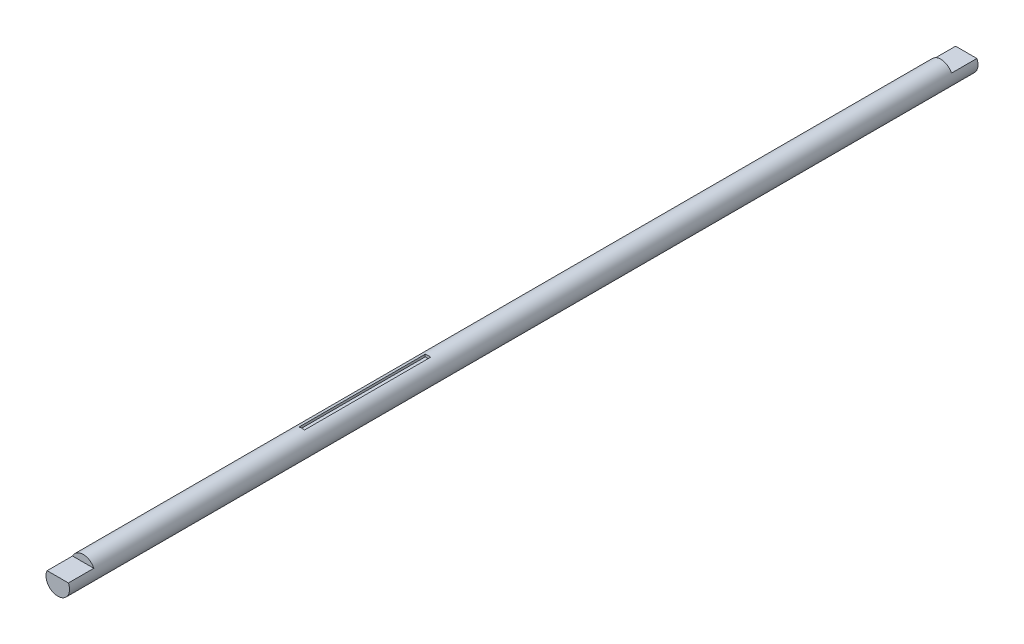
ISO-10303-21;
HEADER;
FILE_DESCRIPTION(('STEP AP214'),'2;1');
FILE_NAME('part.step','',(''),(''),'','','');
FILE_SCHEMA(('AUTOMOTIVE_DESIGN { 1 0 10303 214 1 1 1 1 }'));
ENDSEC;
DATA;
#1=APPLICATION_CONTEXT('core data for automotive mechanical design processes');
#2=APPLICATION_PROTOCOL_DEFINITION('international standard','automotive_design',2000,#1);
#3=PRODUCT_CONTEXT('',#1,'mechanical');
#4=PRODUCT('Part','Part','',(#3));
#5=PRODUCT_RELATED_PRODUCT_CATEGORY('part','',(#4));
#6=PRODUCT_DEFINITION_FORMATION('','',#4);
#7=PRODUCT_DEFINITION_CONTEXT('part definition',#1,'design');
#8=PRODUCT_DEFINITION('design','',#6,#7);
#9=PRODUCT_DEFINITION_SHAPE('','',#8);
#10=(LENGTH_UNIT() NAMED_UNIT(*) SI_UNIT(.MILLI.,.METRE.));
#11=(NAMED_UNIT(*) PLANE_ANGLE_UNIT() SI_UNIT($,.RADIAN.));
#12=(NAMED_UNIT(*) SI_UNIT($,.STERADIAN.) SOLID_ANGLE_UNIT());
#13=UNCERTAINTY_MEASURE_WITH_UNIT(LENGTH_MEASURE(1.E-05),#10,'distance_accuracy_value','');
#14=(GEOMETRIC_REPRESENTATION_CONTEXT(3) GLOBAL_UNCERTAINTY_ASSIGNED_CONTEXT((#13)) GLOBAL_UNIT_ASSIGNED_CONTEXT((#10,
#11,#12)) REPRESENTATION_CONTEXT('',''));
#15=CARTESIAN_POINT('',(0.,0.,0.));
#16=DIRECTION('',(0.,0.,1.));
#17=DIRECTION('',(1.,0.,0.));
#18=AXIS2_PLACEMENT_3D('',#15,#16,#17);
#19=CARTESIAN_POINT('',(0.,0.,270.));
#20=DIRECTION('',(0.,0.,-1.));
#21=DIRECTION('',(-1.,0.,0.));
#22=AXIS2_PLACEMENT_3D('',#19,#20,#21);
#23=CYLINDRICAL_SURFACE('',#22,7.);
#24=CARTESIAN_POINT('',(0.,0.,50.));
#25=DIRECTION('',(0.,0.,1.));
#26=DIRECTION('',(1.,0.,0.));
#27=AXIS2_PLACEMENT_3D('',#24,#25,#26);
#28=CIRCLE('',#27,7.);
#29=CARTESIAN_POINT('',(1.5875,6.81761276034361,50.));
#30=VERTEX_POINT('',#29);
#31=CARTESIAN_POINT('',(-1.5875,6.81761276034361,50.));
#32=VERTEX_POINT('',#31);
#33=EDGE_CURVE('E11',#30,#32,#28,.T.);
#34=ORIENTED_EDGE('',*,*,#33,.F.);
#35=DIRECTION('',(0.,0.,-1.));
#36=VECTOR('',#35,1.);
#37=CARTESIAN_POINT('',(1.5875,6.81761276034361,270.));
#38=LINE('',#37,#36);
#39=CARTESIAN_POINT('',(1.5875,6.81761276034361,125.));
#40=VERTEX_POINT('',#39);
#41=EDGE_CURVE('E163',#30,#40,#38,.F.);
#42=ORIENTED_EDGE('',*,*,#41,.T.);
#43=CARTESIAN_POINT('',(0.,0.,125.));
#44=DIRECTION('',(0.,0.,1.));
#45=DIRECTION('',(1.,0.,0.));
#46=AXIS2_PLACEMENT_3D('',#43,#44,#45);
#47=CIRCLE('',#46,7.);
#48=CARTESIAN_POINT('',(-1.5875,6.81761276034361,125.));
#49=VERTEX_POINT('',#48);
#50=EDGE_CURVE('E159',#40,#49,#47,.T.);
#51=ORIENTED_EDGE('',*,*,#50,.T.);
#52=DIRECTION('',(0.,0.,-1.));
#53=VECTOR('',#52,1.);
#54=CARTESIAN_POINT('',(-1.5875,6.81761276034361,270.));
#55=LINE('',#54,#53);
#56=EDGE_CURVE('E50',#49,#32,#55,.T.);
#57=ORIENTED_EDGE('',*,*,#56,.T.);
#58=EDGE_LOOP('',(#34,#42,#51,#57));
#59=FACE_BOUND('',#58,.T.);
#60=CARTESIAN_POINT('',(0.,0.,270.));
#61=DIRECTION('',(0.,0.,1.));
#62=DIRECTION('',(1.,0.,0.));
#63=AXIS2_PLACEMENT_3D('',#60,#61,#62);
#64=CIRCLE('',#63,7.);
#65=CARTESIAN_POINT('',(-6.32455532033676,3.,270.));
#66=VERTEX_POINT('',#65);
#67=CARTESIAN_POINT('',(6.32455532033676,3.,270.));
#68=VERTEX_POINT('',#67);
#69=EDGE_CURVE('E156',#66,#68,#64,.T.);
#70=ORIENTED_EDGE('',*,*,#69,.F.);
#71=DIRECTION('',(0.,0.,1.));
#72=VECTOR('',#71,1.);
#73=CARTESIAN_POINT('',(-6.32455532033676,3.,254.9));
#74=LINE('',#73,#72);
#75=CARTESIAN_POINT('',(-6.32455532033676,3.,254.9));
#76=VERTEX_POINT('',#75);
#77=EDGE_CURVE('E150',#76,#66,#74,.T.);
#78=ORIENTED_EDGE('',*,*,#77,.F.);
#79=CARTESIAN_POINT('',(0.,0.,254.9));
#80=DIRECTION('',(0.,0.,1.));
#81=DIRECTION('',(-1.,0.,0.));
#82=AXIS2_PLACEMENT_3D('',#79,#80,#81);
#83=CIRCLE('',#82,7.);
#84=CARTESIAN_POINT('',(6.32455532033676,3.,254.9));
#85=VERTEX_POINT('',#84);
#86=EDGE_CURVE('E145',#85,#76,#83,.T.);
#87=ORIENTED_EDGE('',*,*,#86,.F.);
#88=DIRECTION('',(0.,0.,1.));
#89=VECTOR('',#88,1.);
#90=CARTESIAN_POINT('',(6.32455532033676,3.,254.9));
#91=LINE('',#90,#89);
#92=EDGE_CURVE('E152',#85,#68,#91,.T.);
#93=ORIENTED_EDGE('',*,*,#92,.T.);
#94=EDGE_LOOP('',(#70,#78,#87,#93));
#95=FACE_BOUND('',#94,.T.);
#96=DIRECTION('',(0.,0.,-1.));
#97=VECTOR('',#96,1.);
#98=CARTESIAN_POINT('',(6.32455532033676,3.,-254.9));
#99=LINE('',#98,#97);
#100=CARTESIAN_POINT('',(6.32455532033676,3.,-254.9));
#101=VERTEX_POINT('',#100);
#102=CARTESIAN_POINT('',(6.32455532033676,3.,-270.));
#103=VERTEX_POINT('',#102);
#104=EDGE_CURVE('E57',#101,#103,#99,.T.);
#105=ORIENTED_EDGE('',*,*,#104,.F.);
#106=CARTESIAN_POINT('',(0.,0.,-254.9));
#107=DIRECTION('',(0.,0.,1.));
#108=DIRECTION('',(-1.,0.,0.));
#109=AXIS2_PLACEMENT_3D('',#106,#107,#108);
#110=CIRCLE('',#109,7.);
#111=CARTESIAN_POINT('',(-6.32455532033676,3.,-254.9));
#112=VERTEX_POINT('',#111);
#113=EDGE_CURVE('E111',#101,#112,#110,.T.);
#114=ORIENTED_EDGE('',*,*,#113,.T.);
#115=DIRECTION('',(0.,0.,-1.));
#116=VECTOR('',#115,1.);
#117=CARTESIAN_POINT('',(-6.32455532033676,3.,-254.9));
#118=LINE('',#117,#116);
#119=CARTESIAN_POINT('',(-6.32455532033676,3.,-270.));
#120=VERTEX_POINT('',#119);
#121=EDGE_CURVE('E108',#112,#120,#118,.T.);
#122=ORIENTED_EDGE('',*,*,#121,.T.);
#123=CARTESIAN_POINT('',(0.,0.,-270.));
#124=DIRECTION('',(0.,0.,1.));
#125=DIRECTION('',(1.,0.,0.));
#126=AXIS2_PLACEMENT_3D('',#123,#124,#125);
#127=CIRCLE('',#126,7.);
#128=EDGE_CURVE('E119',#120,#103,#127,.T.);
#129=ORIENTED_EDGE('',*,*,#128,.T.);
#130=EDGE_LOOP('',(#105,#114,#122,#129));
#131=FACE_BOUND('',#130,.T.);
#132=ADVANCED_FACE('F43',(#59,#95,#131),#23,.T.);
#133=CARTESIAN_POINT('',(0.,0.,-270.));
#134=DIRECTION('',(0.,0.,1.));
#135=DIRECTION('',(1.,0.,0.));
#136=AXIS2_PLACEMENT_3D('',#133,#134,#135);
#137=PLANE('',#136);
#138=DIRECTION('',(1.,0.,0.));
#139=VECTOR('',#138,1.);
#140=CARTESIAN_POINT('',(-6.32455532033676,3.,-270.));
#141=LINE('',#140,#139);
#142=EDGE_CURVE('E115',#120,#103,#141,.T.);
#143=ORIENTED_EDGE('',*,*,#142,.T.);
#144=ORIENTED_EDGE('',*,*,#128,.F.);
#145=EDGE_LOOP('',(#143,#144));
#146=FACE_BOUND('',#145,.T.);
#147=ADVANCED_FACE('F194',(#146),#137,.F.);
#148=CARTESIAN_POINT('',(0.,0.,270.));
#149=DIRECTION('',(0.,0.,1.));
#150=DIRECTION('',(1.,0.,0.));
#151=AXIS2_PLACEMENT_3D('',#148,#149,#150);
#152=PLANE('',#151);
#153=DIRECTION('',(1.,0.,0.));
#154=VECTOR('',#153,1.);
#155=CARTESIAN_POINT('',(-6.32455532033676,3.,270.));
#156=LINE('',#155,#154);
#157=EDGE_CURVE('E142',#66,#68,#156,.T.);
#158=ORIENTED_EDGE('',*,*,#157,.F.);
#159=ORIENTED_EDGE('',*,*,#69,.T.);
#160=EDGE_LOOP('',(#158,#159));
#161=FACE_BOUND('',#160,.T.);
#162=ADVANCED_FACE('F198',(#161),#152,.T.);
#163=CARTESIAN_POINT('',(-6.32455532033676,3.,254.9));
#164=DIRECTION('',(0.,-1.,0.));
#165=DIRECTION('',(0.,0.,-1.));
#166=AXIS2_PLACEMENT_3D('',#163,#164,#165);
#167=PLANE('',#166);
#168=ORIENTED_EDGE('',*,*,#157,.T.);
#169=ORIENTED_EDGE('',*,*,#92,.F.);
#170=DIRECTION('',(1.,0.,0.));
#171=VECTOR('',#170,1.);
#172=CARTESIAN_POINT('',(-6.32455532033676,3.,254.9));
#173=LINE('',#172,#171);
#174=EDGE_CURVE('E147',#76,#85,#173,.T.);
#175=ORIENTED_EDGE('',*,*,#174,.F.);
#176=ORIENTED_EDGE('',*,*,#77,.T.);
#177=EDGE_LOOP('',(#168,#169,#175,#176));
#178=FACE_BOUND('',#177,.T.);
#179=ADVANCED_FACE('F203',(#178),#167,.F.);
#180=CARTESIAN_POINT('',(0.,0.,254.9));
#181=DIRECTION('',(0.,0.,-1.));
#182=DIRECTION('',(-1.,0.,0.));
#183=AXIS2_PLACEMENT_3D('',#180,#181,#182);
#184=PLANE('',#183);
#185=ORIENTED_EDGE('',*,*,#86,.T.);
#186=ORIENTED_EDGE('',*,*,#174,.T.);
#187=EDGE_LOOP('',(#185,#186));
#188=FACE_BOUND('',#187,.T.);
#189=ADVANCED_FACE('F209',(#188),#184,.F.);
#190=CARTESIAN_POINT('',(-1.5875,5.4125,50.));
#191=DIRECTION('',(-1.,0.,0.));
#192=DIRECTION('',(0.,0.,1.));
#193=AXIS2_PLACEMENT_3D('',#190,#191,#192);
#194=PLANE('',#193);
#195=DIRECTION('',(0.,-1.,0.));
#196=VECTOR('',#195,1.);
#197=CARTESIAN_POINT('',(-1.5875,5.4125,125.));
#198=LINE('',#197,#196);
#199=CARTESIAN_POINT('',(-1.5875,5.4125,125.));
#200=VERTEX_POINT('',#199);
#201=EDGE_CURVE('E65',#49,#200,#198,.T.);
#202=ORIENTED_EDGE('',*,*,#201,.T.);
#203=DIRECTION('',(0.,0.,1.));
#204=VECTOR('',#203,1.);
#205=CARTESIAN_POINT('',(-1.5875,5.4125,50.));
#206=LINE('',#205,#204);
#207=CARTESIAN_POINT('',(-1.5875,5.4125,50.));
#208=VERTEX_POINT('',#207);
#209=EDGE_CURVE('E133',#208,#200,#206,.T.);
#210=ORIENTED_EDGE('',*,*,#209,.F.);
#211=DIRECTION('',(0.,-1.,0.));
#212=VECTOR('',#211,1.);
#213=CARTESIAN_POINT('',(-1.5875,5.4125,50.));
#214=LINE('',#213,#212);
#215=EDGE_CURVE('E124',#32,#208,#214,.T.);
#216=ORIENTED_EDGE('',*,*,#215,.F.);
#217=ORIENTED_EDGE('',*,*,#56,.F.);
#218=EDGE_LOOP('',(#202,#210,#216,#217));
#219=FACE_BOUND('',#218,.T.);
#220=ADVANCED_FACE('F171',(#219),#194,.F.);
#221=CARTESIAN_POINT('',(1.5875,5.4125,50.));
#222=DIRECTION('',(1.,0.,0.));
#223=DIRECTION('',(0.,0.,-1.));
#224=AXIS2_PLACEMENT_3D('',#221,#222,#223);
#225=PLANE('',#224);
#226=DIRECTION('',(0.,1.,0.));
#227=VECTOR('',#226,1.);
#228=CARTESIAN_POINT('',(1.5875,5.4125,50.));
#229=LINE('',#228,#227);
#230=CARTESIAN_POINT('',(1.5875,5.4125,50.));
#231=VERTEX_POINT('',#230);
#232=EDGE_CURVE('E130',#231,#30,#229,.T.);
#233=ORIENTED_EDGE('',*,*,#232,.F.);
#234=DIRECTION('',(0.,0.,1.));
#235=VECTOR('',#234,1.);
#236=CARTESIAN_POINT('',(1.5875,5.4125,50.));
#237=LINE('',#236,#235);
#238=CARTESIAN_POINT('',(1.5875,5.4125,125.));
#239=VERTEX_POINT('',#238);
#240=EDGE_CURVE('E140',#231,#239,#237,.T.);
#241=ORIENTED_EDGE('',*,*,#240,.T.);
#242=DIRECTION('',(0.,1.,0.));
#243=VECTOR('',#242,1.);
#244=CARTESIAN_POINT('',(1.5875,5.4125,125.));
#245=LINE('',#244,#243);
#246=EDGE_CURVE('E127',#239,#40,#245,.T.);
#247=ORIENTED_EDGE('',*,*,#246,.T.);
#248=ORIENTED_EDGE('',*,*,#41,.F.);
#249=EDGE_LOOP('',(#233,#241,#247,#248));
#250=FACE_BOUND('',#249,.T.);
#251=ADVANCED_FACE('F178',(#250),#225,.F.);
#252=CARTESIAN_POINT('',(0.,0.,50.));
#253=DIRECTION('',(0.,0.,1.));
#254=DIRECTION('',(1.,0.,0.));
#255=AXIS2_PLACEMENT_3D('',#252,#253,#254);
#256=PLANE('',#255);
#257=ORIENTED_EDGE('',*,*,#33,.T.);
#258=ORIENTED_EDGE('',*,*,#215,.T.);
#259=DIRECTION('',(1.,0.,0.));
#260=VECTOR('',#259,1.);
#261=CARTESIAN_POINT('',(1.5875,5.4125,50.));
#262=LINE('',#261,#260);
#263=EDGE_CURVE('E126',#208,#231,#262,.T.);
#264=ORIENTED_EDGE('',*,*,#263,.T.);
#265=ORIENTED_EDGE('',*,*,#232,.T.);
#266=EDGE_LOOP('',(#257,#258,#264,#265));
#267=FACE_BOUND('',#266,.T.);
#268=ADVANCED_FACE('F175',(#267),#256,.T.);
#269=CARTESIAN_POINT('',(0.,0.,125.));
#270=DIRECTION('',(0.,0.,1.));
#271=DIRECTION('',(1.,0.,0.));
#272=AXIS2_PLACEMENT_3D('',#269,#270,#271);
#273=PLANE('',#272);
#274=ORIENTED_EDGE('',*,*,#246,.F.);
#275=DIRECTION('',(1.,0.,0.));
#276=VECTOR('',#275,1.);
#277=CARTESIAN_POINT('',(1.5875,5.4125,125.));
#278=LINE('',#277,#276);
#279=EDGE_CURVE('E135',#200,#239,#278,.T.);
#280=ORIENTED_EDGE('',*,*,#279,.F.);
#281=ORIENTED_EDGE('',*,*,#201,.F.);
#282=ORIENTED_EDGE('',*,*,#50,.F.);
#283=EDGE_LOOP('',(#274,#280,#281,#282));
#284=FACE_BOUND('',#283,.T.);
#285=ADVANCED_FACE('F180',(#284),#273,.F.);
#286=CARTESIAN_POINT('',(1.5875,5.4125,50.));
#287=DIRECTION('',(0.,-1.,0.));
#288=DIRECTION('',(1.,0.,0.));
#289=AXIS2_PLACEMENT_3D('',#286,#287,#288);
#290=PLANE('',#289);
#291=ORIENTED_EDGE('',*,*,#279,.T.);
#292=ORIENTED_EDGE('',*,*,#240,.F.);
#293=ORIENTED_EDGE('',*,*,#263,.F.);
#294=ORIENTED_EDGE('',*,*,#209,.T.);
#295=EDGE_LOOP('',(#291,#292,#293,#294));
#296=FACE_BOUND('',#295,.T.);
#297=ADVANCED_FACE('F182',(#296),#290,.F.);
#298=CARTESIAN_POINT('',(-6.32455532033676,3.,-254.9));
#299=DIRECTION('',(0.,1.,0.));
#300=DIRECTION('',(0.,0.,1.));
#301=AXIS2_PLACEMENT_3D('',#298,#299,#300);
#302=PLANE('',#301);
#303=ORIENTED_EDGE('',*,*,#142,.F.);
#304=ORIENTED_EDGE('',*,*,#121,.F.);
#305=DIRECTION('',(1.,0.,0.));
#306=VECTOR('',#305,1.);
#307=CARTESIAN_POINT('',(-6.32455532033676,3.,-254.9));
#308=LINE('',#307,#306);
#309=EDGE_CURVE('E104',#112,#101,#308,.T.);
#310=ORIENTED_EDGE('',*,*,#309,.T.);
#311=ORIENTED_EDGE('',*,*,#104,.T.);
#312=EDGE_LOOP('',(#303,#304,#310,#311));
#313=FACE_BOUND('',#312,.T.);
#314=ADVANCED_FACE('F106',(#313),#302,.T.);
#315=CARTESIAN_POINT('',(0.,0.,-254.9));
#316=DIRECTION('',(0.,0.,1.));
#317=DIRECTION('',(-1.,0.,0.));
#318=AXIS2_PLACEMENT_3D('',#315,#316,#317);
#319=PLANE('',#318);
#320=ORIENTED_EDGE('',*,*,#113,.F.);
#321=ORIENTED_EDGE('',*,*,#309,.F.);
#322=EDGE_LOOP('',(#320,#321));
#323=FACE_BOUND('',#322,.T.);
#324=ADVANCED_FACE('F113',(#323),#319,.F.);
#325=CLOSED_SHELL('',(#132,#147,#162,#179,#189,#220,#251,#268,#285,#297,#314,#324));
#326=MANIFOLD_SOLID_BREP('B2',#325);
#327=ADVANCED_BREP_SHAPE_REPRESENTATION('',(#18,#326),#14);
#328=SHAPE_DEFINITION_REPRESENTATION(#9,#327);
ENDSEC;
END-ISO-10303-21;
